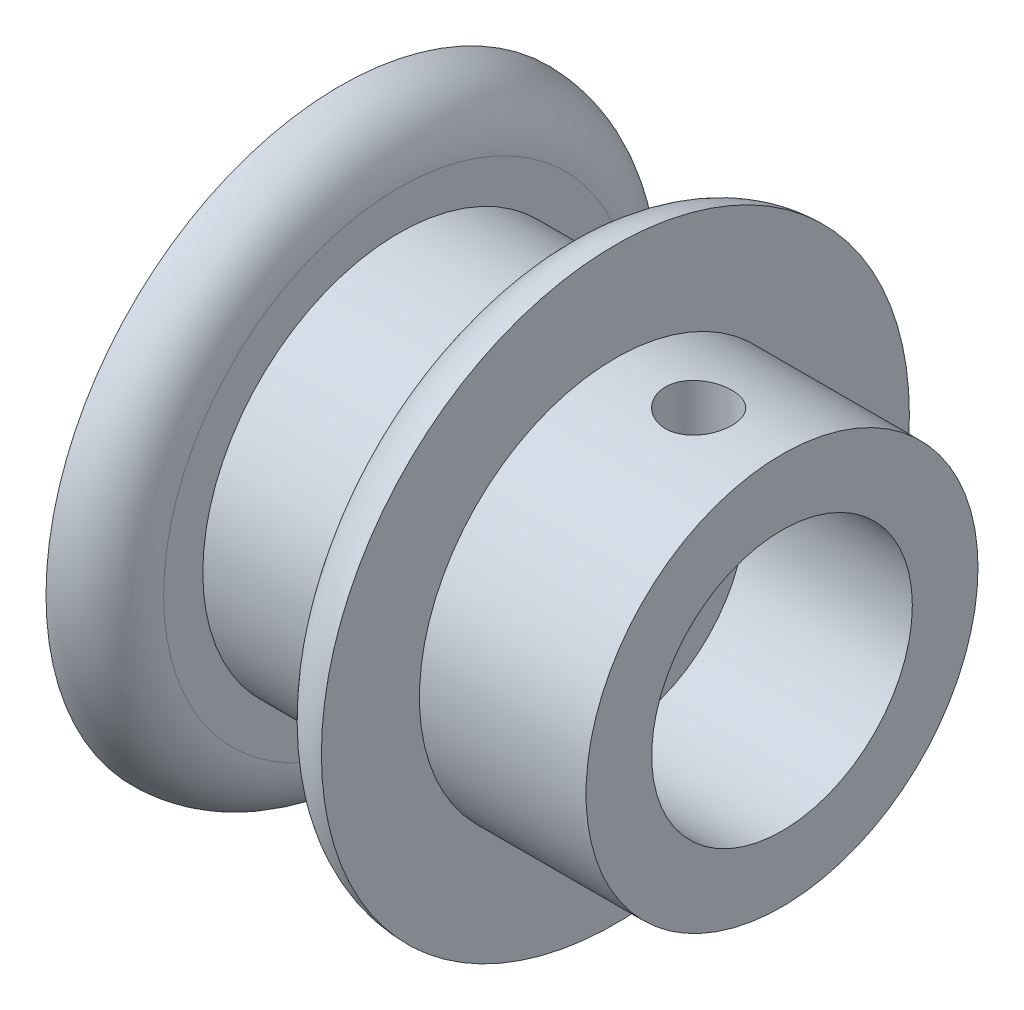
ISO-10303-21;
HEADER;
FILE_DESCRIPTION(('STEP AP214'),'2;1');
FILE_NAME('part.step','',(''),(''),'','','');
FILE_SCHEMA(('AUTOMOTIVE_DESIGN { 1 0 10303 214 1 1 1 1 }'));
ENDSEC;
DATA;
#1=APPLICATION_CONTEXT('core data for automotive mechanical design processes');
#2=APPLICATION_PROTOCOL_DEFINITION('international standard','automotive_design',2000,#1);
#3=PRODUCT_CONTEXT('',#1,'mechanical');
#4=PRODUCT('Part','Part','',(#3));
#5=PRODUCT_RELATED_PRODUCT_CATEGORY('part','',(#4));
#6=PRODUCT_DEFINITION_FORMATION('','',#4);
#7=PRODUCT_DEFINITION_CONTEXT('part definition',#1,'design');
#8=PRODUCT_DEFINITION('design','',#6,#7);
#9=PRODUCT_DEFINITION_SHAPE('','',#8);
#10=(LENGTH_UNIT() NAMED_UNIT(*) SI_UNIT(.MILLI.,.METRE.));
#11=(NAMED_UNIT(*) PLANE_ANGLE_UNIT() SI_UNIT($,.RADIAN.));
#12=(NAMED_UNIT(*) SI_UNIT($,.STERADIAN.) SOLID_ANGLE_UNIT());
#13=UNCERTAINTY_MEASURE_WITH_UNIT(LENGTH_MEASURE(1.E-05),#10,'distance_accuracy_value','');
#14=(GEOMETRIC_REPRESENTATION_CONTEXT(3) GLOBAL_UNCERTAINTY_ASSIGNED_CONTEXT((#13)) GLOBAL_UNIT_ASSIGNED_CONTEXT((#10,
#11,#12)) REPRESENTATION_CONTEXT('',''));
#15=CARTESIAN_POINT('',(0.,0.,0.));
#16=DIRECTION('',(0.,0.,1.));
#17=DIRECTION('',(1.,0.,0.));
#18=AXIS2_PLACEMENT_3D('',#15,#16,#17);
#19=CARTESIAN_POINT('',(14.35,0.,0.));
#20=DIRECTION('',(-1.,0.,0.));
#21=DIRECTION('',(0.,0.,1.));
#22=AXIS2_PLACEMENT_3D('',#19,#20,#21);
#23=CYLINDRICAL_SURFACE('',#22,10.);
#24=CARTESIAN_POINT('',(11.05,0.,0.));
#25=DIRECTION('',(-1.,0.,0.));
#26=DIRECTION('',(0.,0.,1.));
#27=AXIS2_PLACEMENT_3D('',#24,#25,#26);
#28=CIRCLE('',#27,10.);
#29=CARTESIAN_POINT('',(11.05,0.,10.));
#30=VERTEX_POINT('',#29);
#31=EDGE_CURVE('E202',#30,#30,#28,.T.);
#32=ORIENTED_EDGE('',*,*,#31,.T.);
#33=EDGE_LOOP('',(#32));
#34=FACE_BOUND('',#33,.T.);
#35=CARTESIAN_POINT('',(3.,0.,0.));
#36=DIRECTION('',(-1.,0.,0.));
#37=DIRECTION('',(0.,0.,1.));
#38=AXIS2_PLACEMENT_3D('',#35,#36,#37);
#39=CIRCLE('',#38,10.);
#40=CARTESIAN_POINT('',(3.,0.,10.));
#41=VERTEX_POINT('',#40);
#42=EDGE_CURVE('E206',#41,#41,#39,.T.);
#43=ORIENTED_EDGE('',*,*,#42,.F.);
#44=EDGE_LOOP('',(#43));
#45=FACE_BOUND('',#44,.T.);
#46=CARTESIAN_POINT('',(7.025,-6.31961232988227,-7.75));
#47=CARTESIAN_POINT('',(7.05671131935181,-6.31961583899357,-7.74999734539491));
#48=CARTESIAN_POINT('',(7.08848552093832,-6.32211216844962,-7.7479635923501));
#49=CARTESIAN_POINT('',(7.15084864596859,-6.33181079323916,-7.74003930218316));
#50=CARTESIAN_POINT('',(7.1814335171934,-6.33902789881131,-7.73413662717883));
#51=CARTESIAN_POINT('',(7.24018110022536,-6.35732647569247,-7.71910205154204));
#52=CARTESIAN_POINT('',(7.26836556215114,-6.36836727391256,-7.71000412536987));
#53=CARTESIAN_POINT('',(7.32225441593476,-6.39348902284435,-7.68918493993377));
#54=CARTESIAN_POINT('',(7.34795864762489,-6.40757016970509,-7.67746351141198));
#55=CARTESIAN_POINT('',(7.41006885327582,-6.44630421034035,-7.6450043966142));
#56=CARTESIAN_POINT('',(7.44472332120352,-6.47255021836506,-7.62282341995208));
#57=CARTESIAN_POINT('',(7.50828164409094,-6.52855307618897,-7.5749169778178));
#58=CARTESIAN_POINT('',(7.53716886609755,-6.55831969735602,-7.5491816124262));
#59=CARTESIAN_POINT('',(7.60196313569553,-6.6345832895204,-7.48237414583219));
#60=CARTESIAN_POINT('',(7.6347848111025,-6.68236612062845,-7.43978026188278));
#61=CARTESIAN_POINT('',(7.69000732388248,-6.78020546190807,-7.350729074749));
#62=CARTESIAN_POINT('',(7.71239779707687,-6.83026417938608,-7.30426798298287));
#63=CARTESIAN_POINT('',(7.74775184041745,-6.93275445319893,-7.20708352397458));
#64=CARTESIAN_POINT('',(7.76040018901961,-6.98521136086229,-7.15627248837369));
#65=CARTESIAN_POINT('',(7.7749653176827,-7.0897221693208,-7.05274739770064));
#66=CARTESIAN_POINT('',(7.77688548155911,-7.14177619201768,-7.00003394795617));
#67=CARTESIAN_POINT('',(7.76958977690388,-7.24114736708809,-6.89714310966707));
#68=CARTESIAN_POINT('',(7.76105425704708,-7.28855853279868,-6.8470101264526));
#69=CARTESIAN_POINT('',(7.73307547373322,-7.38085012432225,-6.74741702948007));
#70=CARTESIAN_POINT('',(7.7136441258757,-7.42573325587093,-6.6979562410312));
#71=CARTESIAN_POINT('',(7.66916712400966,-7.50074298441897,-6.61371366022835));
#72=CARTESIAN_POINT('',(7.64673026243301,-7.53175814029557,-6.5783473709198));
#73=CARTESIAN_POINT('',(7.5946979712368,-7.59062192540846,-6.51033557198872));
#74=CARTESIAN_POINT('',(7.56511312622475,-7.61847514796417,-6.47768613452409));
#75=CARTESIAN_POINT('',(7.50539555431114,-7.66465875162634,-6.42292937501548));
#76=CARTESIAN_POINT('',(7.47660084559086,-7.68377337172748,-6.40002911377584));
#77=CARTESIAN_POINT('',(7.41451018573851,-7.71860013683691,-6.35798367442424));
#78=CARTESIAN_POINT('',(7.38121540493428,-7.73431316373799,-6.33883752314807));
#79=CARTESIAN_POINT('',(7.31033492894825,-7.76169453592378,-6.30528148420465));
#80=CARTESIAN_POINT('',(7.27271347118292,-7.77332539233536,-6.29091555534916));
#81=CARTESIAN_POINT('',(7.19453211478936,-7.79158734229766,-6.26828392586892));
#82=CARTESIAN_POINT('',(7.15397563491703,-7.79822415341538,-6.26001124945076));
#83=CARTESIAN_POINT('',(7.07772500095102,-7.80543091263535,-6.25102188342532));
#84=CARTESIAN_POINT('',(7.04221105141202,-7.80675990135643,-6.24935999835756));
#85=CARTESIAN_POINT('',(6.97139093258339,-7.80538146600734,-6.25108167142371));
#86=CARTESIAN_POINT('',(6.93608469281959,-7.80267550098579,-6.25446340577324));
#87=CARTESIAN_POINT('',(6.86912766032608,-7.79370000720431,-6.26564328634259));
#88=CARTESIAN_POINT('',(6.83739007949093,-7.78768004506077,-6.27313201338791));
#89=CARTESIAN_POINT('',(6.77583177770254,-7.77255047138078,-6.29186803744455));
#90=CARTESIAN_POINT('',(6.74601123786844,-7.76344056842021,-6.30311568897292));
#91=CARTESIAN_POINT('',(6.68691982859271,-7.74179449548173,-6.32968631962204));
#92=CARTESIAN_POINT('',(6.65781869874492,-7.72907012327007,-6.3452313154843));
#93=CARTESIAN_POINT('',(6.60280074270778,-7.70099407419733,-6.37927727478394));
#94=CARTESIAN_POINT('',(6.57688584238319,-7.68564082163466,-6.39778001059085));
#95=CARTESIAN_POINT('',(6.5177506226008,-7.64551550158245,-6.44573066694355));
#96=CARTESIAN_POINT('',(6.48632365171757,-7.61956906886346,-6.47641556957483));
#97=CARTESIAN_POINT('',(6.43039327216849,-7.56428769131835,-6.54089958868193));
#98=CARTESIAN_POINT('',(6.40590442733096,-7.53494579815429,-6.57470506133554));
#99=CARTESIAN_POINT('',(6.35693269559163,-7.46423465799109,-6.65498826754179));
#100=CARTESIAN_POINT('',(6.33483556392492,-7.42196915613601,-6.7021289566772));
#101=CARTESIAN_POINT('',(6.30107713050678,-7.33471197849613,-6.79751407243923));
#102=CARTESIAN_POINT('',(6.28942218684305,-7.28971865956009,-6.84575915320554));
#103=CARTESIAN_POINT('',(6.27552666352332,-7.19717916858437,-6.94299688419766));
#104=CARTESIAN_POINT('',(6.27348101567966,-7.14959978754143,-6.99198494867738));
#105=CARTESIAN_POINT('',(6.27869350280691,-7.05366679094346,-7.08875432592308));
#106=CARTESIAN_POINT('',(6.28596165047396,-7.00531239743752,-7.1365342835835));
#107=CARTESIAN_POINT('',(6.31195783863745,-6.89877445257509,-7.23971555141682));
#108=CARTESIAN_POINT('',(6.3327471975991,-6.84062887058359,-7.29464636148774));
#109=CARTESIAN_POINT('',(6.38776334593821,-6.72657318906916,-7.39994544682451));
#110=CARTESIAN_POINT('',(6.42196610917676,-6.67065928836446,-7.45032168281847));
#111=CARTESIAN_POINT('',(6.48729772877422,-6.58710498888228,-7.52407562466172));
#112=CARTESIAN_POINT('',(6.51346691946883,-6.55761346755675,-7.5497744859109));
#113=CARTESIAN_POINT('',(6.57105778441431,-6.50143359473612,-7.59820524305184));
#114=CARTESIAN_POINT('',(6.60247084601062,-6.47474076177361,-7.62094189686648));
#115=CARTESIAN_POINT('',(6.66271732009866,-6.43154748329821,-7.65740157582913));
#116=CARTESIAN_POINT('',(6.69037260418507,-6.4141358443627,-7.67198007023564));
#117=CARTESIAN_POINT('',(6.74894512640395,-6.3827866178149,-7.69808094141434));
#118=CARTESIAN_POINT('',(6.77985870940527,-6.36884519516072,-7.70960669277708));
#119=CARTESIAN_POINT('',(6.83797271656857,-6.3479635122048,-7.72680431401434));
#120=CARTESIAN_POINT('',(6.86465602841078,-6.34017699062146,-7.73318915207849));
#121=CARTESIAN_POINT('',(6.919301203343,-6.3281559201042,-7.74302942031903));
#122=CARTESIAN_POINT('',(6.94725922884887,-6.3239113677577,-7.74649310087674));
#123=CARTESIAN_POINT('',(6.98367394500565,-6.32095319162462,-7.74890644035014));
#124=CARTESIAN_POINT('',(6.99192411744026,-6.32045129051135,-7.74931582548456));
#125=CARTESIAN_POINT('',(7.00844809545283,-6.31978037033586,-7.74986297732352));
#126=CARTESIAN_POINT('',(7.01672190518048,-6.31961141384482,-7.75000069297251));
#127=CARTESIAN_POINT('',(7.025,-6.31961232988227,-7.75));
#128=B_SPLINE_CURVE_WITH_KNOTS('',3,(#46,#47,#48,#49,#50,#51,#52,#53,#54,#55,#56,#57,#58,#59,
#60,#61,#62,#63,#64,#65,#66,#67,#68,#69,#70,#71,#72,#73,#74,#75,#76,#77,#78,#79,#80,#81,#82,#83,
#84,#85,#86,#87,#88,#89,#90,#91,#92,#93,#94,#95,#96,#97,#98,#99,#100,#101,#102,#103,#104,#105,
#106,#107,#108,#109,#110,#111,#112,#113,#114,#115,#116,#117,#118,#119,#120,#121,#122,#123,#124,
#125,#126,#127),.UNSPECIFIED.,.T.,.F.,(4,2,2,2,2,2,2,2,2,2,2,2,2,2,2,2,2,2,2,2,2,2,2,2,2,2,2,2,
2,2,2,2,2,2,2,2,2,2,2,2,4),(0.,0.0950913985444813,0.190482562390868,0.284888714340682,
0.379300958753557,0.524889438792787,0.670891921380013,0.885540965423521,1.10040282686298,
1.32195460806698,1.54343650487708,1.75124148043671,1.95881964393218,2.11462852344598,
2.27020808292395,2.39411053198079,2.51798081967156,2.6429606146047,2.76779710444053,
2.87395894838048,2.98008241325953,3.07913181367513,3.1781905584169,3.28386544851839,
3.38960390131978,3.54180313834498,3.6943195291428,3.89442157508454,4.09464537744596,
4.29891382166183,4.50340204681708,4.75023272873911,4.99662329129127,5.13746566116524,
5.27807894407994,5.38508204506984,5.49196636334202,5.57718990590778,5.66217193321513,
5.68699044394437,5.71181361843735),.UNSPECIFIED.);
#129=CARTESIAN_POINT('',(7.025,-6.31961232988227,-7.75));
#130=VERTEX_POINT('',#129);
#131=EDGE_CURVE('E120',#130,#130,#128,.T.);
#132=ORIENTED_EDGE('',*,*,#131,.F.);
#133=EDGE_LOOP('',(#132));
#134=FACE_BOUND('',#133,.T.);
#135=CARTESIAN_POINT('',(7.025,6.31961232988227,-7.75));
#136=CARTESIAN_POINT('',(6.99328868064819,6.31961583899357,-7.74999734539491));
#137=CARTESIAN_POINT('',(6.96151447906168,6.32211216844962,-7.7479635923501));
#138=CARTESIAN_POINT('',(6.89915135403141,6.33181079323916,-7.74003930218316));
#139=CARTESIAN_POINT('',(6.8685664828066,6.33902789881131,-7.73413662717883));
#140=CARTESIAN_POINT('',(6.80981889977464,6.35732647569247,-7.71910205154204));
#141=CARTESIAN_POINT('',(6.78163443784885,6.36836727391256,-7.71000412536987));
#142=CARTESIAN_POINT('',(6.72774558406523,6.39348902284435,-7.68918493993377));
#143=CARTESIAN_POINT('',(6.70204135237511,6.40757016970509,-7.67746351141198));
#144=CARTESIAN_POINT('',(6.63993114672418,6.44630421034035,-7.6450043966142));
#145=CARTESIAN_POINT('',(6.60527667879648,6.47255021836506,-7.62282341995208));
#146=CARTESIAN_POINT('',(6.54171835590906,6.52855307618897,-7.5749169778178));
#147=CARTESIAN_POINT('',(6.51283113390245,6.55831969735602,-7.5491816124262));
#148=CARTESIAN_POINT('',(6.44803686430446,6.6345832895204,-7.48237414583219));
#149=CARTESIAN_POINT('',(6.41521518889749,6.68236612062845,-7.43978026188278));
#150=CARTESIAN_POINT('',(6.35999267611752,6.78020546190807,-7.350729074749));
#151=CARTESIAN_POINT('',(6.33760220292312,6.83026417938608,-7.30426798298287));
#152=CARTESIAN_POINT('',(6.30224815958255,6.93275445319893,-7.20708352397458));
#153=CARTESIAN_POINT('',(6.28959981098039,6.98521136086229,-7.15627248837369));
#154=CARTESIAN_POINT('',(6.2750346823173,7.0897221693208,-7.05274739770064));
#155=CARTESIAN_POINT('',(6.27311451844089,7.14177619201768,-7.00003394795617));
#156=CARTESIAN_POINT('',(6.28041022309612,7.24114736708809,-6.89714310966707));
#157=CARTESIAN_POINT('',(6.28894574295291,7.28855853279868,-6.8470101264526));
#158=CARTESIAN_POINT('',(6.31692452626678,7.38085012432225,-6.74741702948007));
#159=CARTESIAN_POINT('',(6.3363558741243,7.42573325587093,-6.6979562410312));
#160=CARTESIAN_POINT('',(6.38083287599033,7.50074298441897,-6.61371366022835));
#161=CARTESIAN_POINT('',(6.40326973756699,7.53175814029557,-6.5783473709198));
#162=CARTESIAN_POINT('',(6.4553020287632,7.59062192540846,-6.51033557198872));
#163=CARTESIAN_POINT('',(6.48488687377525,7.61847514796417,-6.47768613452409));
#164=CARTESIAN_POINT('',(6.54460444568886,7.66465875162634,-6.42292937501548));
#165=CARTESIAN_POINT('',(6.57339915440914,7.68377337172748,-6.40002911377584));
#166=CARTESIAN_POINT('',(6.63548981426149,7.71860013683691,-6.35798367442424));
#167=CARTESIAN_POINT('',(6.66878459506571,7.73431316373799,-6.33883752314807));
#168=CARTESIAN_POINT('',(6.73966507105175,7.76169453592378,-6.30528148420465));
#169=CARTESIAN_POINT('',(6.77728652881708,7.77332539233536,-6.29091555534916));
#170=CARTESIAN_POINT('',(6.85546788521064,7.79158734229766,-6.26828392586892));
#171=CARTESIAN_POINT('',(6.89602436508297,7.79822415341538,-6.26001124945076));
#172=CARTESIAN_POINT('',(6.97227499904897,7.80543091263535,-6.25102188342533));
#173=CARTESIAN_POINT('',(7.00778894858798,7.80675990135643,-6.24935999835756));
#174=CARTESIAN_POINT('',(7.0786090674166,7.80538146600734,-6.25108167142371));
#175=CARTESIAN_POINT('',(7.11391530718041,7.80267550098579,-6.25446340577324));
#176=CARTESIAN_POINT('',(7.18087233967392,7.79370000720431,-6.26564328634259));
#177=CARTESIAN_POINT('',(7.21260992050907,7.78768004506077,-6.27313201338791));
#178=CARTESIAN_POINT('',(7.27416822229746,7.77255047138078,-6.29186803744455));
#179=CARTESIAN_POINT('',(7.30398876213156,7.76344056842021,-6.30311568897292));
#180=CARTESIAN_POINT('',(7.36308017140729,7.74179449548173,-6.32968631962204));
#181=CARTESIAN_POINT('',(7.39218130125508,7.72907012327007,-6.3452313154843));
#182=CARTESIAN_POINT('',(7.44719925729222,7.70099407419733,-6.37927727478394));
#183=CARTESIAN_POINT('',(7.47311415761681,7.68564082163466,-6.39778001059084));
#184=CARTESIAN_POINT('',(7.5322493773992,7.64551550158245,-6.44573066694355));
#185=CARTESIAN_POINT('',(7.56367634828243,7.61956906886346,-6.47641556957483));
#186=CARTESIAN_POINT('',(7.6196067278315,7.56428769131835,-6.54089958868193));
#187=CARTESIAN_POINT('',(7.64409557266904,7.53494579815429,-6.57470506133554));
#188=CARTESIAN_POINT('',(7.69306730440837,7.46423465799109,-6.65498826754179));
#189=CARTESIAN_POINT('',(7.71516443607508,7.42196915613601,-6.7021289566772));
#190=CARTESIAN_POINT('',(7.74892286949322,7.33471197849613,-6.79751407243923));
#191=CARTESIAN_POINT('',(7.76057781315694,7.28971865956009,-6.84575915320554));
#192=CARTESIAN_POINT('',(7.77447333647668,7.19717916858437,-6.94299688419766));
#193=CARTESIAN_POINT('',(7.77651898432034,7.14959978754143,-6.99198494867738));
#194=CARTESIAN_POINT('',(7.77130649719309,7.05366679094346,-7.08875432592308));
#195=CARTESIAN_POINT('',(7.76403834952603,7.00531239743752,-7.1365342835835));
#196=CARTESIAN_POINT('',(7.73804216136255,6.89877445257509,-7.23971555141682));
#197=CARTESIAN_POINT('',(7.7172528024009,6.84062887058359,-7.29464636148774));
#198=CARTESIAN_POINT('',(7.66223665406179,6.72657318906916,-7.39994544682451));
#199=CARTESIAN_POINT('',(7.62803389082324,6.67065928836446,-7.45032168281847));
#200=CARTESIAN_POINT('',(7.56270227122578,6.58710498888228,-7.52407562466172));
#201=CARTESIAN_POINT('',(7.53653308053117,6.55761346755675,-7.5497744859109));
#202=CARTESIAN_POINT('',(7.47894221558569,6.50143359473612,-7.59820524305184));
#203=CARTESIAN_POINT('',(7.44752915398938,6.47474076177361,-7.62094189686648));
#204=CARTESIAN_POINT('',(7.38728267990134,6.43154748329821,-7.65740157582913));
#205=CARTESIAN_POINT('',(7.35962739581492,6.4141358443627,-7.67198007023563));
#206=CARTESIAN_POINT('',(7.30105487359605,6.3827866178149,-7.69808094141434));
#207=CARTESIAN_POINT('',(7.27014129059473,6.36884519516072,-7.70960669277708));
#208=CARTESIAN_POINT('',(7.21202728343142,6.3479635122048,-7.72680431401434));
#209=CARTESIAN_POINT('',(7.18534397158922,6.34017699062146,-7.73318915207849));
#210=CARTESIAN_POINT('',(7.130698796657,6.3281559201042,-7.74302942031903));
#211=CARTESIAN_POINT('',(7.10274077115113,6.3239113677577,-7.74649310087674));
#212=CARTESIAN_POINT('',(7.06632605499435,6.32095319162462,-7.74890644035014));
#213=CARTESIAN_POINT('',(7.05807588255974,6.32045129051135,-7.74931582548456));
#214=CARTESIAN_POINT('',(7.04155190454717,6.31978037033586,-7.74986297732352));
#215=CARTESIAN_POINT('',(7.03327809481952,6.31961141384482,-7.75000069297251));
#216=CARTESIAN_POINT('',(7.025,6.31961232988227,-7.75));
#217=B_SPLINE_CURVE_WITH_KNOTS('',3,(#135,#136,#137,#138,#139,#140,#141,#142,#143,#144,#145,
#146,#147,#148,#149,#150,#151,#152,#153,#154,#155,#156,#157,#158,#159,#160,#161,#162,#163,#164,
#165,#166,#167,#168,#169,#170,#171,#172,#173,#174,#175,#176,#177,#178,#179,#180,#181,#182,#183,
#184,#185,#186,#187,#188,#189,#190,#191,#192,#193,#194,#195,#196,#197,#198,#199,#200,#201,#202,
#203,#204,#205,#206,#207,#208,#209,#210,#211,#212,#213,#214,#215,#216),.UNSPECIFIED.,.T.,.F.,(4,
2,2,2,2,2,2,2,2,2,2,2,2,2,2,2,2,2,2,2,2,2,2,2,2,2,2,2,2,2,2,2,2,2,2,2,2,2,2,2,4),(0.,
0.0950913985444813,0.190482562390868,0.284888714340682,0.379300958753557,0.524889438792787,
0.670891921380013,0.885540965423521,1.10040282686298,1.32195460806698,1.54343650487708,
1.75124148043671,1.95881964393218,2.11462852344598,2.27020808292395,2.39411053198079,
2.51798081967156,2.6429606146047,2.76779710444053,2.87395894838048,2.98008241325953,
3.07913181367513,3.1781905584169,3.28386544851838,3.38960390131978,3.54180313834498,
3.6943195291428,3.89442157508453,4.09464537744596,4.29891382166183,4.50340204681708,
4.75023272873911,4.99662329129127,5.13746566116524,5.27807894407994,5.38508204506984,
5.49196636334202,5.57718990590778,5.66217193321513,5.68699044394437,5.71181361843735),.UNSPECIFIED.);
#218=CARTESIAN_POINT('',(7.025,6.31961232988227,-7.75));
#219=VERTEX_POINT('',#218);
#220=EDGE_CURVE('E128',#219,#219,#217,.T.);
#221=ORIENTED_EDGE('',*,*,#220,.F.);
#222=EDGE_LOOP('',(#221));
#223=FACE_BOUND('',#222,.T.);
#224=ADVANCED_FACE('F96',(#34,#45,#134,#223),#23,.T.);
#225=CARTESIAN_POINT('',(22.55,0.,0.));
#226=DIRECTION('',(-1.,0.,0.));
#227=DIRECTION('',(0.,0.,1.));
#228=AXIS2_PLACEMENT_3D('',#225,#226,#227);
#229=CYLINDRICAL_SURFACE('',#228,10.);
#230=CARTESIAN_POINT('',(22.55,0.,0.));
#231=DIRECTION('',(1.,0.,0.));
#232=DIRECTION('',(0.,0.,-1.));
#233=AXIS2_PLACEMENT_3D('',#230,#231,#232);
#234=CIRCLE('',#233,10.);
#235=CARTESIAN_POINT('',(22.55,0.,-10.));
#236=VERTEX_POINT('',#235);
#237=EDGE_CURVE('E159',#236,#236,#234,.T.);
#238=ORIENTED_EDGE('',*,*,#237,.F.);
#239=EDGE_LOOP('',(#238));
#240=FACE_BOUND('',#239,.T.);
#241=CARTESIAN_POINT('',(14.05,0.,0.));
#242=DIRECTION('',(1.,0.,0.));
#243=DIRECTION('',(0.,0.,-1.));
#244=AXIS2_PLACEMENT_3D('',#241,#242,#243);
#245=CIRCLE('',#244,10.);
#246=CARTESIAN_POINT('',(14.05,0.,-10.));
#247=VERTEX_POINT('',#246);
#248=EDGE_CURVE('E116',#247,#247,#245,.T.);
#249=ORIENTED_EDGE('',*,*,#248,.T.);
#250=EDGE_LOOP('',(#249));
#251=FACE_BOUND('',#250,.T.);
#252=CARTESIAN_POINT('',(18.3,9.85444062339411,-1.7));
#253=CARTESIAN_POINT('',(18.2052534649637,9.854442356295,-1.69999621649372));
#254=CARTESIAN_POINT('',(18.110455886545,9.8558218619989,-1.69205236850887));
#255=CARTESIAN_POINT('',(17.9235225921226,9.86118552557618,-1.66050183095464));
#256=CARTESIAN_POINT('',(17.8313893807429,9.86517205605423,-1.63688087364838));
#257=CARTESIAN_POINT('',(17.6525171222584,9.87528550436611,-1.57471301665924));
#258=CARTESIAN_POINT('',(17.565773561144,9.88141060182033,-1.53617880833877));
#259=CARTESIAN_POINT('',(17.399991712,9.89510888837665,-1.44531022520491));
#260=CARTESIAN_POINT('',(17.3209525989199,9.90268192216498,-1.39297733028804));
#261=CARTESIAN_POINT('',(17.1720041966838,9.91850952633435,-1.27542475228633));
#262=CARTESIAN_POINT('',(17.1021853438427,9.9267697131631,-1.21009121960315));
#263=CARTESIAN_POINT('',(16.9744452454144,9.94299106010902,-1.06863799138398));
#264=CARTESIAN_POINT('',(16.9165247161788,9.95095220219832,-0.992517646882126));
#265=CARTESIAN_POINT('',(16.8138848776026,9.96573800698524,-0.831064332803035));
#266=CARTESIAN_POINT('',(16.7692499081513,9.97255529389106,-0.745677013124075));
#267=CARTESIAN_POINT('',(16.6949905093994,9.98422270662782,-0.568481212242846));
#268=CARTESIAN_POINT('',(16.6653650650233,9.98907296548197,-0.476673165744276));
#269=CARTESIAN_POINT('',(16.6222427538992,9.99622017704092,-0.290176813748989));
#270=CARTESIAN_POINT('',(16.6085938515897,9.99854118365381,-0.195524599329201));
#271=CARTESIAN_POINT('',(16.5973391550261,10.0004510598545,-0.00524702365921039));
#272=CARTESIAN_POINT('',(16.5997322282394,10.0000401223124,0.0903782684176729));
#273=CARTESIAN_POINT('',(16.6203752849733,9.99655141573196,0.278847563719001));
#274=CARTESIAN_POINT('',(16.6384616361411,9.99350116745014,0.371710071998059));
#275=CARTESIAN_POINT('',(16.6897200081486,9.98510727643561,0.553062682410544));
#276=CARTESIAN_POINT('',(16.7228925028593,9.97976356166312,0.641552647101169));
#277=CARTESIAN_POINT('',(16.8035431085487,9.96733643017686,0.812133066667868));
#278=CARTESIAN_POINT('',(16.8510883368598,9.96024488081523,0.894191171762423));
#279=CARTESIAN_POINT('',(16.9590855613557,9.94510941601268,1.0492260047775));
#280=CARTESIAN_POINT('',(17.0195386432755,9.93706542048282,1.12220196794231));
#281=CARTESIAN_POINT('',(17.1525422251706,9.92079929057186,1.25796821292378));
#282=CARTESIAN_POINT('',(17.225235765684,9.91257618919859,1.32061832994034));
#283=CARTESIAN_POINT('',(17.3801756435009,9.89697664909201,1.43285517699425));
#284=CARTESIAN_POINT('',(17.4624220759546,9.8896002187933,1.48244177689815));
#285=CARTESIAN_POINT('',(17.6342991550656,9.87652856434534,1.56717343707084));
#286=CARTESIAN_POINT('',(17.7239385469265,9.87083536887573,1.60230109085748));
#287=CARTESIAN_POINT('',(17.9079642738404,9.86180794533985,1.65696076605407));
#288=CARTESIAN_POINT('',(18.0023501720864,9.8584735006286,1.67649421977094));
#289=CARTESIAN_POINT('',(18.1919340437956,9.85458318425938,1.69921253781924));
#290=CARTESIAN_POINT('',(18.287107369975,9.85399331564818,1.70259744691701));
#291=CARTESIAN_POINT('',(18.476660455538,9.85556832140301,1.69345615975314));
#292=CARTESIAN_POINT('',(18.5710402467131,9.85773308487551,1.68093060400092));
#293=CARTESIAN_POINT('',(18.7556883401202,9.86454199085967,1.64049468289922));
#294=CARTESIAN_POINT('',(18.8459797043043,9.86916964250663,1.6126866054459));
#295=CARTESIAN_POINT('',(19.0206208673813,9.88036901079755,1.54258247848049));
#296=CARTESIAN_POINT('',(19.1049702975888,9.88694084794306,1.50028553091563));
#297=CARTESIAN_POINT('',(19.2662221637756,9.90136686065762,1.40193397795963));
#298=CARTESIAN_POINT('',(19.3430455162887,9.90923271788595,1.34575145610453));
#299=CARTESIAN_POINT('',(19.4862459056347,9.92532652215461,1.22139866734358));
#300=CARTESIAN_POINT('',(19.5526221761565,9.9335544957002,1.15322752182779));
#301=CARTESIAN_POINT('',(19.6737772768521,9.94955324584647,1.0059452237807));
#302=CARTESIAN_POINT('',(19.7284225241108,9.95731809632886,0.92672344338147));
#303=CARTESIAN_POINT('',(19.8236276478669,9.97141995256055,0.760107841067543));
#304=CARTESIAN_POINT('',(19.8641879940485,9.97775700591962,0.67271429177725));
#305=CARTESIAN_POINT('',(19.929865279729,9.9882635377853,0.49262852491368));
#306=CARTESIAN_POINT('',(19.9550514629131,9.99244272179452,0.399962151131165));
#307=CARTESIAN_POINT('',(19.9894881661372,9.9982037242737,0.211637938805084));
#308=CARTESIAN_POINT('',(19.9987400527012,9.99978576547385,0.115980357503657));
#309=CARTESIAN_POINT('',(20.0010049497643,10.0001708857948,-0.0743228634954029));
#310=CARTESIAN_POINT('',(19.9942209774459,9.99900870748225,-0.168966077874183));
#311=CARTESIAN_POINT('',(19.9650466878298,9.99410708889383,-0.35574408310669));
#312=CARTESIAN_POINT('',(19.9426564666653,9.99036766449358,-0.447878889408378));
#313=CARTESIAN_POINT('',(19.8829843608166,9.98073042078463,-0.626942613139807));
#314=CARTESIAN_POINT('',(19.8457204076999,9.97483520118792,-0.713877654743987));
#315=CARTESIAN_POINT('',(19.7573814737375,9.96152908406076,-0.880292690560635));
#316=CARTESIAN_POINT('',(19.7063057956822,9.95411811002032,-0.959772308153828));
#317=CARTESIAN_POINT('',(19.5910767040158,9.93849036902565,-1.11004142876127));
#318=CARTESIAN_POINT('',(19.5267749148339,9.93026506348753,-1.1807162791609));
#319=CARTESIAN_POINT('',(19.387229836964,9.91399400549237,-1.31034413938171));
#320=CARTESIAN_POINT('',(19.3119839887237,9.90594829554756,-1.36929439944643));
#321=CARTESIAN_POINT('',(19.1520251590098,9.89088301293595,-1.47420176274809));
#322=CARTESIAN_POINT('',(19.0672462901782,9.88387146755588,-1.5200595697773));
#323=CARTESIAN_POINT('',(18.891102762947,9.87176347965544,-1.5968119190342));
#324=CARTESIAN_POINT('',(18.7997447326089,9.86666514100721,-1.62772128508297));
#325=CARTESIAN_POINT('',(18.6400361572472,9.8600813011692,-1.66705161652064));
#326=CARTESIAN_POINT('',(18.5726480978205,9.85797792829127,-1.67938723505559));
#327=CARTESIAN_POINT('',(18.4368488896983,9.85515697698072,-1.69586271379581));
#328=CARTESIAN_POINT('',(18.3684377608668,9.85443937167701,-1.70000273291997));
#329=CARTESIAN_POINT('',(18.3,9.85444062339411,-1.7));
#330=B_SPLINE_CURVE_WITH_KNOTS('',3,(#252,#253,#254,#255,#256,#257,#258,#259,#260,#261,#262,
#263,#264,#265,#266,#267,#268,#269,#270,#271,#272,#273,#274,#275,#276,#277,#278,#279,#280,#281,
#282,#283,#284,#285,#286,#287,#288,#289,#290,#291,#292,#293,#294,#295,#296,#297,#298,#299,#300,
#301,#302,#303,#304,#305,#306,#307,#308,#309,#310,#311,#312,#313,#314,#315,#316,#317,#318,#319,
#320,#321,#322,#323,#324,#325,#326,#327,#328,#329),.UNSPECIFIED.,.T.,.F.,(4,2,2,2,2,2,2,2,2,2,2,
2,2,2,2,2,2,2,2,2,2,2,2,2,2,2,2,2,2,2,2,2,2,2,2,2,2,2,4),(0.,0.283989313370199,
0.568237440474544,0.852244198919823,1.13622051028061,1.42280275033741,1.70940223933834,
1.99778411877998,2.28614649271358,2.57174185737941,2.85731705977314,3.13994989868364,
3.42259161598944,3.70657414627999,3.99058057297476,4.27817113783456,4.56576456744646,
4.85370321247213,5.14161540766572,5.4259515800966,5.71027630633632,5.99272078611149,
6.27518277559963,6.56035075015217,6.84553963251833,7.13382142974897,7.42209361282708,
7.70905767825911,7.99599713245237,8.27932336938368,8.56264786106316,8.84563180734718,
9.12863004119924,9.41499555667971,9.70142815418729,9.98997867403851,10.2782424591684,
10.4833789276586,10.6885114183582),.UNSPECIFIED.);
#331=CARTESIAN_POINT('',(18.3,9.85444062339411,-1.7));
#332=VERTEX_POINT('',#331);
#333=EDGE_CURVE('E151',#332,#332,#330,.T.);
#334=ORIENTED_EDGE('',*,*,#333,.F.);
#335=EDGE_LOOP('',(#334));
#336=FACE_BOUND('',#335,.T.);
#337=ADVANCED_FACE('F163',(#240,#251,#336),#229,.T.);
#338=CARTESIAN_POINT('',(14.05,0.,0.));
#339=DIRECTION('',(1.,0.,0.));
#340=DIRECTION('',(0.,0.,-1.));
#341=AXIS2_PLACEMENT_3D('',#338,#339,#340);
#342=PLANE('',#341);
#343=CARTESIAN_POINT('',(14.05,0.,0.));
#344=DIRECTION('',(1.,0.,0.));
#345=DIRECTION('',(0.,0.,-1.));
#346=AXIS2_PLACEMENT_3D('',#343,#344,#345);
#347=CIRCLE('',#346,3.2);
#348=CARTESIAN_POINT('',(14.05,0.,-3.2));
#349=VERTEX_POINT('',#348);
#350=EDGE_CURVE('E228',#349,#349,#347,.T.);
#351=ORIENTED_EDGE('',*,*,#350,.F.);
#352=EDGE_LOOP('',(#351));
#353=FACE_BOUND('',#352,.T.);
#354=CARTESIAN_POINT('',(14.05,0.,0.));
#355=DIRECTION('',(1.,0.,0.));
#356=DIRECTION('',(0.,0.,-1.));
#357=AXIS2_PLACEMENT_3D('',#354,#355,#356);
#358=CIRCLE('',#357,6.65);
#359=CARTESIAN_POINT('',(14.05,0.,-6.65));
#360=VERTEX_POINT('',#359);
#361=EDGE_CURVE('E160',#360,#360,#358,.F.);
#362=ORIENTED_EDGE('',*,*,#361,.F.);
#363=EDGE_LOOP('',(#362));
#364=FACE_BOUND('',#363,.T.);
#365=ADVANCED_FACE('F167',(#353,#364),#342,.T.);
#366=CARTESIAN_POINT('',(0.,0.,0.));
#367=DIRECTION('',(1.,0.,0.));
#368=DIRECTION('',(0.,0.,-1.));
#369=AXIS2_PLACEMENT_3D('',#366,#367,#368);
#370=PLANE('',#369);
#371=CARTESIAN_POINT('',(0.,0.,0.));
#372=DIRECTION('',(1.,0.,0.));
#373=DIRECTION('',(0.,0.,-1.));
#374=AXIS2_PLACEMENT_3D('',#371,#372,#373);
#375=CIRCLE('',#374,3.2);
#376=CARTESIAN_POINT('',(0.,0.,-3.2));
#377=VERTEX_POINT('',#376);
#378=EDGE_CURVE('E241',#377,#377,#375,.F.);
#379=ORIENTED_EDGE('',*,*,#378,.F.);
#380=EDGE_LOOP('',(#379));
#381=FACE_BOUND('',#380,.T.);
#382=CARTESIAN_POINT('',(0.,0.,0.));
#383=DIRECTION('',(-1.,0.,0.));
#384=DIRECTION('',(0.,0.,1.));
#385=AXIS2_PLACEMENT_3D('',#382,#383,#384);
#386=CIRCLE('',#385,15.);
#387=CARTESIAN_POINT('',(0.,0.,15.));
#388=VERTEX_POINT('',#387);
#389=EDGE_CURVE('E245',#388,#388,#386,.T.);
#390=ORIENTED_EDGE('',*,*,#389,.T.);
#391=EDGE_LOOP('',(#390));
#392=FACE_BOUND('',#391,.T.);
#393=ADVANCED_FACE('F181',(#381,#392),#370,.F.);
#394=CARTESIAN_POINT('',(3.,0.,0.));
#395=DIRECTION('',(-1.,0.,0.));
#396=DIRECTION('',(0.,0.,1.));
#397=AXIS2_PLACEMENT_3D('',#394,#395,#396);
#398=PLANE('',#397);
#399=CARTESIAN_POINT('',(3.,0.,0.));
#400=DIRECTION('',(-1.,0.,0.));
#401=DIRECTION('',(0.,0.,1.));
#402=AXIS2_PLACEMENT_3D('',#399,#400,#401);
#403=CIRCLE('',#402,12.);
#404=CARTESIAN_POINT('',(3.,0.,12.));
#405=VERTEX_POINT('',#404);
#406=EDGE_CURVE('E11',#405,#405,#403,.F.);
#407=ORIENTED_EDGE('',*,*,#406,.T.);
#408=EDGE_LOOP('',(#407));
#409=FACE_BOUND('',#408,.T.);
#410=ORIENTED_EDGE('',*,*,#42,.T.);
#411=EDGE_LOOP('',(#410));
#412=FACE_BOUND('',#411,.T.);
#413=ADVANCED_FACE('F178',(#409,#412),#398,.F.);
#414=CARTESIAN_POINT('',(3.,0.,0.));
#415=DIRECTION('',(-1.,0.,0.));
#416=DIRECTION('',(0.,0.,1.));
#417=AXIS2_PLACEMENT_3D('',#414,#415,#416);
#418=CYLINDRICAL_SURFACE('',#417,3.2);
#419=ORIENTED_EDGE('',*,*,#378,.T.);
#420=EDGE_LOOP('',(#419));
#421=FACE_BOUND('',#420,.T.);
#422=ORIENTED_EDGE('',*,*,#350,.T.);
#423=EDGE_LOOP('',(#422));
#424=FACE_BOUND('',#423,.T.);
#425=ADVANCED_FACE('F176',(#421,#424),#418,.F.);
#426=ORIENTED_EDGE('',*,*,#248,.F.);
#427=EDGE_LOOP('',(#426));
#428=FACE_BOUND('',#427,.T.);
#429=CARTESIAN_POINT('',(14.05,0.,0.));
#430=DIRECTION('',(1.,0.,0.));
#431=DIRECTION('',(0.,0.,-1.));
#432=AXIS2_PLACEMENT_3D('',#429,#430,#431);
#433=CIRCLE('',#432,15.);
#434=CARTESIAN_POINT('',(14.05,0.,-15.));
#435=VERTEX_POINT('',#434);
#436=EDGE_CURVE('E235',#435,#435,#433,.T.);
#437=ORIENTED_EDGE('',*,*,#436,.T.);
#438=EDGE_LOOP('',(#437));
#439=FACE_BOUND('',#438,.T.);
#440=ADVANCED_FACE('F172',(#428,#439),#342,.T.);
#441=CARTESIAN_POINT('',(11.05,0.,0.));
#442=DIRECTION('',(-1.,0.,0.));
#443=DIRECTION('',(0.,0.,1.));
#444=AXIS2_PLACEMENT_3D('',#441,#442,#443);
#445=PLANE('',#444);
#446=CARTESIAN_POINT('',(11.05,0.,0.));
#447=DIRECTION('',(-1.,0.,0.));
#448=DIRECTION('',(0.,0.,1.));
#449=AXIS2_PLACEMENT_3D('',#446,#447,#448);
#450=CIRCLE('',#449,12.);
#451=CARTESIAN_POINT('',(11.05,0.,12.));
#452=VERTEX_POINT('',#451);
#453=EDGE_CURVE('E110',#452,#452,#450,.T.);
#454=ORIENTED_EDGE('',*,*,#453,.T.);
#455=EDGE_LOOP('',(#454));
#456=FACE_BOUND('',#455,.T.);
#457=ORIENTED_EDGE('',*,*,#31,.F.);
#458=EDGE_LOOP('',(#457));
#459=FACE_BOUND('',#458,.T.);
#460=ADVANCED_FACE('F169',(#456,#459),#445,.T.);
#461=CARTESIAN_POINT('',(22.55,0.,0.));
#462=DIRECTION('',(1.,0.,0.));
#463=DIRECTION('',(0.,0.,-1.));
#464=AXIS2_PLACEMENT_3D('',#461,#462,#463);
#465=PLANE('',#464);
#466=CARTESIAN_POINT('',(22.55,0.,0.));
#467=DIRECTION('',(1.,0.,0.));
#468=DIRECTION('',(0.,0.,-1.));
#469=AXIS2_PLACEMENT_3D('',#466,#467,#468);
#470=CIRCLE('',#469,6.65);
#471=CARTESIAN_POINT('',(22.55,0.,-6.65));
#472=VERTEX_POINT('',#471);
#473=EDGE_CURVE('E219',#472,#472,#470,.T.);
#474=ORIENTED_EDGE('',*,*,#473,.F.);
#475=EDGE_LOOP('',(#474));
#476=FACE_BOUND('',#475,.T.);
#477=ORIENTED_EDGE('',*,*,#237,.T.);
#478=EDGE_LOOP('',(#477));
#479=FACE_BOUND('',#478,.T.);
#480=ADVANCED_FACE('F146',(#476,#479),#465,.T.);
#481=CARTESIAN_POINT('',(18.3,13.5,0.));
#482=DIRECTION('',(0.,-1.,0.));
#483=DIRECTION('',(0.,0.,-1.));
#484=AXIS2_PLACEMENT_3D('',#481,#482,#483);
#485=CYLINDRICAL_SURFACE('',#484,1.7);
#486=CARTESIAN_POINT('',(18.3,6.42903569752105,-1.7));
#487=CARTESIAN_POINT('',(18.206199910831,6.42903744226636,-1.69999746259835));
#488=CARTESIAN_POINT('',(18.1123721631369,6.43111094788567,-1.69221020965962));
#489=CARTESIAN_POINT('',(17.9274161755371,6.43915855535778,-1.66131970733422));
#490=CARTESIAN_POINT('',(17.8362894636852,6.44513482269016,-1.63820795491311));
#491=CARTESIAN_POINT('',(17.6594376695554,6.46026786652419,-1.57746949321829));
#492=CARTESIAN_POINT('',(17.573705584197,6.46942041470098,-1.53986207352006));
#493=CARTESIAN_POINT('',(17.4097567903207,6.48986945375415,-1.45125913863106));
#494=CARTESIAN_POINT('',(17.3315404900213,6.50116606098572,-1.40026289678951));
#495=CARTESIAN_POINT('',(17.1830445002693,6.52492134675436,-1.285076547973));
#496=CARTESIAN_POINT('',(17.1129632090804,6.53739927664335,-1.22063458912809));
#497=CARTESIAN_POINT('',(16.9844764269006,6.56194453805208,-1.08092827654706));
#498=CARTESIAN_POINT('',(16.9260720659638,6.57401182973796,-1.00566287656536));
#499=CARTESIAN_POINT('',(16.8217801409502,6.59658976084561,-0.845081520360612));
#500=CARTESIAN_POINT('',(16.7760882556363,6.60707503590183,-0.759634602442007));
#501=CARTESIAN_POINT('',(16.6997918914446,6.62508748048467,-0.581959652834322));
#502=CARTESIAN_POINT('',(16.6691850816107,6.63261510699266,-0.489732671337748));
#503=CARTESIAN_POINT('',(16.6245653593678,6.64372799076572,-0.303184761150941));
#504=CARTESIAN_POINT('',(16.6102153402408,6.64739322323026,-0.208949310748119));
#505=CARTESIAN_POINT('',(16.5974575758155,6.65064734842422,-0.0193420742020725));
#506=CARTESIAN_POINT('',(16.599047370307,6.65023687021406,0.0760295343127632));
#507=CARTESIAN_POINT('',(16.6178833282993,6.64544504699098,0.262861038007874));
#508=CARTESIAN_POINT('',(16.6347655062617,6.64115602218815,0.354360355315756));
#509=CARTESIAN_POINT('',(16.6831209617473,6.62919699641084,0.533181623021828));
#510=CARTESIAN_POINT('',(16.7145950353207,6.62152681098074,0.620503345227611));
#511=CARTESIAN_POINT('',(16.7915301648629,6.60352749002537,0.789439736684562));
#512=CARTESIAN_POINT('',(16.8371191490131,6.59317418236828,0.870993465096064));
#513=CARTESIAN_POINT('',(16.9408925811621,6.57092919760232,1.0254195189846));
#514=CARTESIAN_POINT('',(16.9990793091697,6.55903724217753,1.09829026926255));
#515=CARTESIAN_POINT('',(17.1283414995504,6.53461179893852,1.23545328246075));
#516=CARTESIAN_POINT('',(17.1997348432407,6.52206967903177,1.29944476833444));
#517=CARTESIAN_POINT('',(17.3523703206942,6.49806370212015,1.41461616326518));
#518=CARTESIAN_POINT('',(17.4336129586728,6.48659990037107,1.4657954160134));
#519=CARTESIAN_POINT('',(17.604251381034,6.46601635095479,1.55409405318855));
#520=CARTESIAN_POINT('',(17.6936878625238,6.4569092702313,1.59113794798421));
#521=CARTESIAN_POINT('',(17.8778088331488,6.44223097508634,1.64956891243476));
#522=CARTESIAN_POINT('',(17.9724921356265,6.43665896466903,1.67095950692786));
#523=CARTESIAN_POINT('',(18.1616218320723,6.42984960569021,1.69697120282964));
#524=CARTESIAN_POINT('',(18.2560028035017,6.42849699804552,1.70203833271824));
#525=CARTESIAN_POINT('',(18.4442623909859,6.42996531875203,1.69648294735349));
#526=CARTESIAN_POINT('',(18.5381410547637,6.43278584329453,1.68586195014529));
#527=CARTESIAN_POINT('',(18.7210543910605,6.44217188392344,1.64962360627577));
#528=CARTESIAN_POINT('',(18.8101447523903,6.44867180430391,1.62426872807006));
#529=CARTESIAN_POINT('',(18.9828099412698,6.46462138177162,1.55957471964256));
#530=CARTESIAN_POINT('',(19.0663840912845,6.4740714003943,1.52023387535426));
#531=CARTESIAN_POINT('',(19.2275264690103,6.49509703942618,1.42776045222223));
#532=CARTESIAN_POINT('',(19.3049373068417,6.50671210580878,1.3743627791002));
#533=CARTESIAN_POINT('',(19.4498636441581,6.53066367064978,1.25562445709347));
#534=CARTESIAN_POINT('',(19.5173774363495,6.54300029306819,1.19028175198472));
#535=CARTESIAN_POINT('',(19.6424148067519,6.56739761785508,1.04745585908602));
#536=CARTESIAN_POINT('',(19.6996290028192,6.57944253444396,0.969698611483747));
#537=CARTESIAN_POINT('',(19.8001892357814,6.60156447639201,0.805422281103158));
#538=CARTESIAN_POINT('',(19.8435360034463,6.61164160543648,0.718903660338088));
#539=CARTESIAN_POINT('',(19.9147466264404,6.62862837636969,0.540164000479002));
#540=CARTESIAN_POINT('',(19.9427235223669,6.63556107681501,0.447990292941268));
#541=CARTESIAN_POINT('',(19.9827361083924,6.64557900072463,0.260048015274669));
#542=CARTESIAN_POINT('',(19.9947750251785,6.64866500295603,0.164280176825953));
#543=CARTESIAN_POINT('',(20.0023815112127,6.65060837569046,-0.0252308168712495));
#544=CARTESIAN_POINT('',(19.9984047219069,6.64958272519152,-0.118954754917944));
#545=CARTESIAN_POINT('',(19.9751410649363,6.64367914600249,-0.304352254364846));
#546=CARTESIAN_POINT('',(19.9558546911186,6.6388013415728,-0.396025881804619));
#547=CARTESIAN_POINT('',(19.9027682478506,6.62576134892429,-0.574219866278165));
#548=CARTESIAN_POINT('',(19.8690539253632,6.61761858249951,-0.660767282965215));
#549=CARTESIAN_POINT('',(19.7881458871616,6.59890405762672,-0.827026152656343));
#550=CARTESIAN_POINT('',(19.7409504058437,6.58833198105176,-0.906736708469698));
#551=CARTESIAN_POINT('',(19.6330487573033,6.56556744095883,-1.05920680697998));
#552=CARTESIAN_POINT('',(19.5720357563364,6.55334121603446,-1.13174416178047));
#553=CARTESIAN_POINT('',(19.4388221488346,6.52879300752935,-1.26570535011088));
#554=CARTESIAN_POINT('',(19.3666186763079,6.51647100018782,-1.32712632786534));
#555=CARTESIAN_POINT('',(19.2113580058351,6.4928483458598,-1.43830523226128));
#556=CARTESIAN_POINT('',(19.1281146679579,6.48157266629924,-1.48780895646905));
#557=CARTESIAN_POINT('',(18.9542099053119,6.46166055238233,-1.57204624855682));
#558=CARTESIAN_POINT('',(18.8635537533516,6.45302226237639,-1.60679020807623));
#559=CARTESIAN_POINT('',(18.6942607935699,6.44066353283961,-1.65555464268839));
#560=CARTESIAN_POINT('',(18.6164097912664,6.43633671158867,-1.67218440980846));
#561=CARTESIAN_POINT('',(18.459045716006,6.43052218791242,-1.69440764460444));
#562=CARTESIAN_POINT('',(18.3795328002619,6.429034218157,-1.70000215145486));
#563=CARTESIAN_POINT('',(18.3,6.42903569752105,-1.7));
#564=B_SPLINE_CURVE_WITH_KNOTS('',3,(#486,#487,#488,#489,#490,#491,#492,#493,#494,#495,#496,
#497,#498,#499,#500,#501,#502,#503,#504,#505,#506,#507,#508,#509,#510,#511,#512,#513,#514,#515,
#516,#517,#518,#519,#520,#521,#522,#523,#524,#525,#526,#527,#528,#529,#530,#531,#532,#533,#534,
#535,#536,#537,#538,#539,#540,#541,#542,#543,#544,#545,#546,#547,#548,#549,#550,#551,#552,#553,
#554,#555,#556,#557,#558,#559,#560,#561,#562,#563),.UNSPECIFIED.,.T.,.F.,(4,2,2,2,2,2,2,2,2,2,2,
2,2,2,2,2,2,2,2,2,2,2,2,2,2,2,2,2,2,2,2,2,2,2,2,2,2,2,4),(0.,0.281108073042882,
0.562372253899247,0.843263437817325,1.12416986967935,1.41090602894334,1.69766992415045,
1.98863033092136,2.27954576418741,2.56431143728879,2.8490331592742,3.12715110958414,
3.40528423420162,3.68601585756307,3.96679833180743,4.2555190887214,4.54425463238069,
4.83451127300228,5.12470253298407,5.4068941012701,5.68905836537416,5.96634389017442,
6.24366340974989,6.52664286407489,6.80967107657977,7.10014169582834,7.39059700566619,
7.67888649015774,7.96711760072942,8.24720739282995,8.52728815033615,8.80572698056207,
9.08420229416025,9.36960364275531,9.65507820664642,9.94618884977366,10.2370941948688,
10.4754672932105,10.71381794323),.UNSPECIFIED.);
#565=CARTESIAN_POINT('',(18.3,6.42903569752105,-1.7));
#566=VERTEX_POINT('',#565);
#567=EDGE_CURVE('E100',#566,#566,#564,.T.);
#568=ORIENTED_EDGE('',*,*,#567,.F.);
#569=EDGE_LOOP('',(#568));
#570=FACE_BOUND('',#569,.T.);
#571=ORIENTED_EDGE('',*,*,#333,.T.);
#572=EDGE_LOOP('',(#571));
#573=FACE_BOUND('',#572,.T.);
#574=ADVANCED_FACE('F140',(#570,#573),#485,.F.);
#575=CARTESIAN_POINT('',(14.05,0.,0.));
#576=DIRECTION('',(-1.,0.,0.));
#577=DIRECTION('',(0.,0.,1.));
#578=AXIS2_PLACEMENT_3D('',#575,#576,#577);
#579=TOROIDAL_SURFACE('',#578,12.,3.);
#580=ORIENTED_EDGE('',*,*,#436,.F.);
#581=EDGE_LOOP('',(#580));
#582=FACE_BOUND('',#581,.T.);
#583=ORIENTED_EDGE('',*,*,#453,.F.);
#584=EDGE_LOOP('',(#583));
#585=FACE_BOUND('',#584,.T.);
#586=ADVANCED_FACE('F145',(#582,#585),#579,.T.);
#587=CARTESIAN_POINT('',(0.,0.,0.));
#588=DIRECTION('',(-1.,0.,0.));
#589=DIRECTION('',(0.,0.,1.));
#590=AXIS2_PLACEMENT_3D('',#587,#588,#589);
#591=TOROIDAL_SURFACE('',#590,12.,3.);
#592=ORIENTED_EDGE('',*,*,#406,.F.);
#593=EDGE_LOOP('',(#592));
#594=FACE_BOUND('',#593,.T.);
#595=ORIENTED_EDGE('',*,*,#389,.F.);
#596=EDGE_LOOP('',(#595));
#597=FACE_BOUND('',#596,.T.);
#598=ADVANCED_FACE('F98',(#594,#597),#591,.T.);
#599=CARTESIAN_POINT('',(7.025,10.,-7.));
#600=DIRECTION('',(0.,-1.,0.));
#601=DIRECTION('',(0.,0.,-1.));
#602=AXIS2_PLACEMENT_3D('',#599,#600,#601);
#603=CYLINDRICAL_SURFACE('',#602,0.750000000000001);
#604=ORIENTED_EDGE('',*,*,#131,.T.);
#605=EDGE_LOOP('',(#604));
#606=FACE_BOUND('',#605,.T.);
#607=ORIENTED_EDGE('',*,*,#220,.T.);
#608=EDGE_LOOP('',(#607));
#609=FACE_BOUND('',#608,.T.);
#610=ADVANCED_FACE('F134',(#606,#609),#603,.F.);
#611=CARTESIAN_POINT('',(-4.75904037956217,0.,0.));
#612=DIRECTION('',(1.,0.,0.));
#613=DIRECTION('',(0.,0.,-1.));
#614=AXIS2_PLACEMENT_3D('',#611,#612,#613);
#615=CYLINDRICAL_SURFACE('',#614,6.65);
#616=ORIENTED_EDGE('',*,*,#567,.T.);
#617=EDGE_LOOP('',(#616));
#618=FACE_BOUND('',#617,.T.);
#619=ORIENTED_EDGE('',*,*,#361,.T.);
#620=EDGE_LOOP('',(#619));
#621=FACE_BOUND('',#620,.T.);
#622=ORIENTED_EDGE('',*,*,#473,.T.);
#623=EDGE_LOOP('',(#622));
#624=FACE_BOUND('',#623,.T.);
#625=ADVANCED_FACE('F137',(#618,#621,#624),#615,.F.);
#626=CLOSED_SHELL('',(#224,#337,#365,#393,#413,#425,#440,#460,#480,#574,#586,#598,#610,#625));
#627=MANIFOLD_SOLID_BREP('B2',#626);
#628=ADVANCED_BREP_SHAPE_REPRESENTATION('',(#18,#627),#14);
#629=SHAPE_DEFINITION_REPRESENTATION(#9,#628);
ENDSEC;
END-ISO-10303-21;
